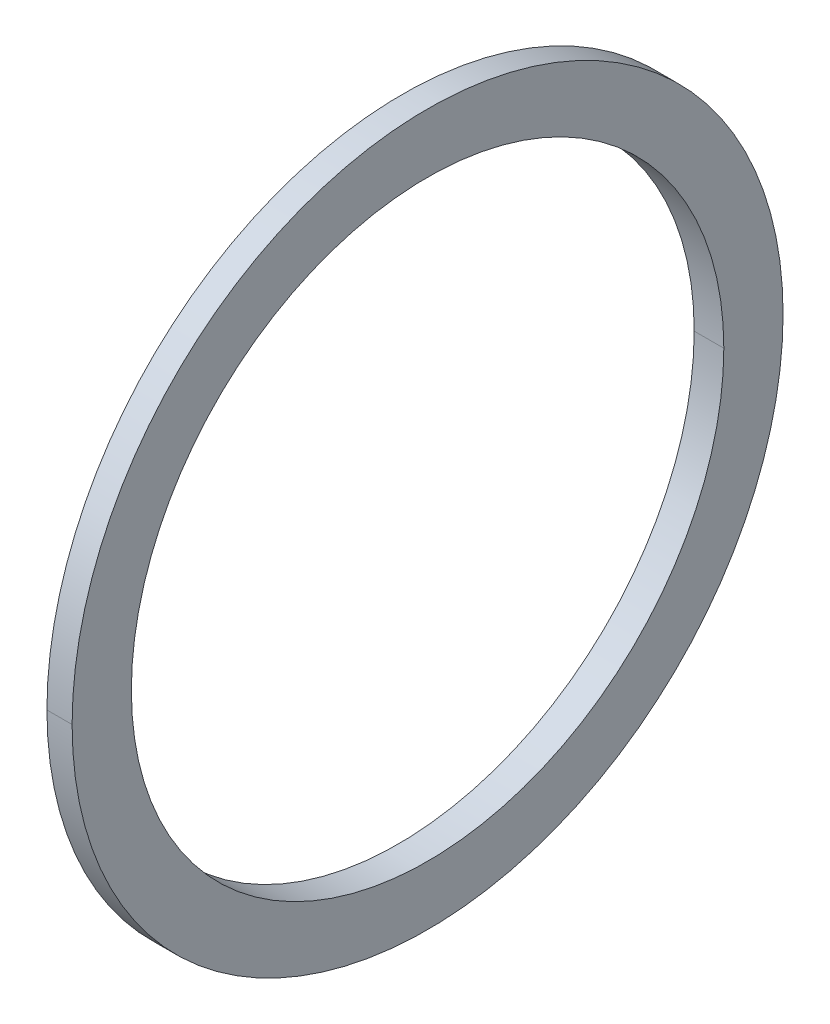
ISO-10303-21;
HEADER;
FILE_DESCRIPTION(('STEP AP214'),'2;1');
FILE_NAME('part.step','',(''),(''),'','','');
FILE_SCHEMA(('AUTOMOTIVE_DESIGN { 1 0 10303 214 1 1 1 1 }'));
ENDSEC;
DATA;
#1=APPLICATION_CONTEXT('core data for automotive mechanical design processes');
#2=APPLICATION_PROTOCOL_DEFINITION('international standard','automotive_design',2000,#1);
#3=PRODUCT_CONTEXT('',#1,'mechanical');
#4=PRODUCT('Part','Part','',(#3));
#5=PRODUCT_RELATED_PRODUCT_CATEGORY('part','',(#4));
#6=PRODUCT_DEFINITION_FORMATION('','',#4);
#7=PRODUCT_DEFINITION_CONTEXT('part definition',#1,'design');
#8=PRODUCT_DEFINITION('design','',#6,#7);
#9=PRODUCT_DEFINITION_SHAPE('','',#8);
#10=(LENGTH_UNIT() NAMED_UNIT(*) SI_UNIT(.MILLI.,.METRE.));
#11=(NAMED_UNIT(*) PLANE_ANGLE_UNIT() SI_UNIT($,.RADIAN.));
#12=(NAMED_UNIT(*) SI_UNIT($,.STERADIAN.) SOLID_ANGLE_UNIT());
#13=UNCERTAINTY_MEASURE_WITH_UNIT(LENGTH_MEASURE(1.E-05),#10,'distance_accuracy_value','');
#14=(GEOMETRIC_REPRESENTATION_CONTEXT(3) GLOBAL_UNCERTAINTY_ASSIGNED_CONTEXT((#13)) GLOBAL_UNIT_ASSIGNED_CONTEXT((#10,
#11,#12)) REPRESENTATION_CONTEXT('',''));
#15=CARTESIAN_POINT('',(0.,0.,0.));
#16=DIRECTION('',(0.,0.,1.));
#17=DIRECTION('',(1.,0.,0.));
#18=AXIS2_PLACEMENT_3D('',#15,#16,#17);
#19=CARTESIAN_POINT('',(0.,0.,0.));
#20=DIRECTION('',(-1.,0.,0.));
#21=DIRECTION('',(0.,0.,1.));
#22=AXIS2_PLACEMENT_3D('',#19,#20,#21);
#23=CYLINDRICAL_SURFACE('',#22,20.);
#24=DIRECTION('',(-1.,0.,0.));
#25=VECTOR('',#24,1.);
#26=CARTESIAN_POINT('',(0.,0.,-20.));
#27=LINE('',#26,#25);
#28=CARTESIAN_POINT('',(10.1578226323666,0.,-20.));
#29=VERTEX_POINT('',#28);
#30=CARTESIAN_POINT('',(8.15782263236658,0.,-20.));
#31=VERTEX_POINT('',#30);
#32=EDGE_CURVE('E107',#29,#31,#27,.T.);
#33=ORIENTED_EDGE('',*,*,#32,.F.);
#34=CARTESIAN_POINT('',(10.1578226323666,0.,0.));
#35=DIRECTION('',(-1.,0.,0.));
#36=DIRECTION('',(0.,0.,1.));
#37=AXIS2_PLACEMENT_3D('',#34,#35,#36);
#38=CIRCLE('',#37,20.);
#39=CARTESIAN_POINT('',(10.1578226323666,0.,20.));
#40=VERTEX_POINT('',#39);
#41=EDGE_CURVE('E79',#40,#29,#38,.T.);
#42=ORIENTED_EDGE('',*,*,#41,.F.);
#43=DIRECTION('',(-1.,0.,0.));
#44=VECTOR('',#43,1.);
#45=CARTESIAN_POINT('',(0.,0.,20.));
#46=LINE('',#45,#44);
#47=CARTESIAN_POINT('',(8.15782263236658,0.,20.));
#48=VERTEX_POINT('',#47);
#49=EDGE_CURVE('E106',#40,#48,#46,.T.);
#50=ORIENTED_EDGE('',*,*,#49,.T.);
#51=CARTESIAN_POINT('',(8.15782263236658,0.,0.));
#52=DIRECTION('',(-1.,0.,0.));
#53=DIRECTION('',(0.,0.,1.));
#54=AXIS2_PLACEMENT_3D('',#51,#52,#53);
#55=CIRCLE('',#54,20.);
#56=EDGE_CURVE('E11',#48,#31,#55,.T.);
#57=ORIENTED_EDGE('',*,*,#56,.T.);
#58=EDGE_LOOP('',(#33,#42,#50,#57));
#59=FACE_BOUND('',#58,.T.);
#60=ADVANCED_FACE('F17',(#59),#23,.F.);
#61=CARTESIAN_POINT('',(8.15782263236658,21.4,0.));
#62=DIRECTION('',(1.,0.,0.));
#63=DIRECTION('',(0.,1.,0.));
#64=AXIS2_PLACEMENT_3D('',#61,#62,#63);
#65=PLANE('',#64);
#66=ORIENTED_EDGE('',*,*,#56,.F.);
#67=CARTESIAN_POINT('',(8.15782263236658,0.,0.));
#68=DIRECTION('',(-1.,0.,0.));
#69=DIRECTION('',(0.,0.,1.));
#70=AXIS2_PLACEMENT_3D('',#67,#68,#69);
#71=CIRCLE('',#70,20.);
#72=EDGE_CURVE('E103',#31,#48,#71,.T.);
#73=ORIENTED_EDGE('',*,*,#72,.F.);
#74=EDGE_LOOP('',(#66,#73));
#75=FACE_BOUND('',#74,.T.);
#76=CARTESIAN_POINT('',(8.15782263236658,0.,0.));
#77=DIRECTION('',(-1.,0.,0.));
#78=DIRECTION('',(0.,0.,1.));
#79=AXIS2_PLACEMENT_3D('',#76,#77,#78);
#80=CIRCLE('',#79,21.4);
#81=CARTESIAN_POINT('',(8.15782263236658,0.,21.4));
#82=VERTEX_POINT('',#81);
#83=CARTESIAN_POINT('',(8.15782263236658,0.,-21.4));
#84=VERTEX_POINT('',#83);
#85=EDGE_CURVE('E99',#82,#84,#80,.T.);
#86=ORIENTED_EDGE('',*,*,#85,.T.);
#87=CARTESIAN_POINT('',(8.15782263236658,0.,0.));
#88=DIRECTION('',(-1.,0.,0.));
#89=DIRECTION('',(0.,0.,1.));
#90=AXIS2_PLACEMENT_3D('',#87,#88,#89);
#91=CIRCLE('',#90,21.4);
#92=EDGE_CURVE('E26',#84,#82,#91,.T.);
#93=ORIENTED_EDGE('',*,*,#92,.T.);
#94=EDGE_LOOP('',(#86,#93));
#95=FACE_BOUND('',#94,.T.);
#96=ADVANCED_FACE('F136',(#75,#95),#65,.F.);
#97=CARTESIAN_POINT('',(0.,0.,0.));
#98=DIRECTION('',(-1.,0.,0.));
#99=DIRECTION('',(0.,0.,1.));
#100=AXIS2_PLACEMENT_3D('',#97,#98,#99);
#101=CYLINDRICAL_SURFACE('',#100,21.4);
#102=DIRECTION('',(-1.,0.,0.));
#103=VECTOR('',#102,1.);
#104=CARTESIAN_POINT('',(0.,0.,-21.4));
#105=LINE('',#104,#103);
#106=CARTESIAN_POINT('',(8.45782263236658,0.,-21.4));
#107=VERTEX_POINT('',#106);
#108=EDGE_CURVE('E115',#107,#84,#105,.T.);
#109=ORIENTED_EDGE('',*,*,#108,.F.);
#110=CARTESIAN_POINT('',(8.45782263236658,0.,0.));
#111=DIRECTION('',(-1.,0.,0.));
#112=DIRECTION('',(0.,0.,1.));
#113=AXIS2_PLACEMENT_3D('',#110,#111,#112);
#114=CIRCLE('',#113,21.4);
#115=CARTESIAN_POINT('',(8.45782263236658,0.,21.4));
#116=VERTEX_POINT('',#115);
#117=EDGE_CURVE('E129',#107,#116,#114,.T.);
#118=ORIENTED_EDGE('',*,*,#117,.T.);
#119=DIRECTION('',(-1.,0.,0.));
#120=VECTOR('',#119,1.);
#121=CARTESIAN_POINT('',(0.,0.,21.4));
#122=LINE('',#121,#120);
#123=EDGE_CURVE('E92',#116,#82,#122,.T.);
#124=ORIENTED_EDGE('',*,*,#123,.T.);
#125=ORIENTED_EDGE('',*,*,#92,.F.);
#126=EDGE_LOOP('',(#109,#118,#124,#125));
#127=FACE_BOUND('',#126,.T.);
#128=ADVANCED_FACE('F143',(#127),#101,.T.);
#129=CARTESIAN_POINT('',(8.45782263236658,24.,0.));
#130=DIRECTION('',(1.,0.,0.));
#131=DIRECTION('',(0.,1.,0.));
#132=AXIS2_PLACEMENT_3D('',#129,#130,#131);
#133=PLANE('',#132);
#134=CARTESIAN_POINT('',(8.45782263236658,0.,0.));
#135=DIRECTION('',(-1.,0.,0.));
#136=DIRECTION('',(0.,0.,1.));
#137=AXIS2_PLACEMENT_3D('',#134,#135,#136);
#138=CIRCLE('',#137,21.4);
#139=EDGE_CURVE('E111',#116,#107,#138,.T.);
#140=ORIENTED_EDGE('',*,*,#139,.F.);
#141=ORIENTED_EDGE('',*,*,#117,.F.);
#142=EDGE_LOOP('',(#140,#141));
#143=FACE_BOUND('',#142,.T.);
#144=CARTESIAN_POINT('',(8.45782263236658,0.,0.));
#145=DIRECTION('',(-1.,0.,0.));
#146=DIRECTION('',(0.,0.,1.));
#147=AXIS2_PLACEMENT_3D('',#144,#145,#146);
#148=CIRCLE('',#147,24.);
#149=CARTESIAN_POINT('',(8.45782263236658,0.,24.));
#150=VERTEX_POINT('',#149);
#151=CARTESIAN_POINT('',(8.45782263236658,0.,-24.));
#152=VERTEX_POINT('',#151);
#153=EDGE_CURVE('E88',#150,#152,#148,.T.);
#154=ORIENTED_EDGE('',*,*,#153,.T.);
#155=CARTESIAN_POINT('',(8.45782263236658,0.,0.));
#156=DIRECTION('',(-1.,0.,0.));
#157=DIRECTION('',(0.,0.,1.));
#158=AXIS2_PLACEMENT_3D('',#155,#156,#157);
#159=CIRCLE('',#158,24.);
#160=EDGE_CURVE('E38',#152,#150,#159,.T.);
#161=ORIENTED_EDGE('',*,*,#160,.T.);
#162=EDGE_LOOP('',(#154,#161));
#163=FACE_BOUND('',#162,.T.);
#164=ADVANCED_FACE('F148',(#143,#163),#133,.F.);
#165=CARTESIAN_POINT('',(0.,0.,0.));
#166=DIRECTION('',(-1.,0.,0.));
#167=DIRECTION('',(0.,0.,1.));
#168=AXIS2_PLACEMENT_3D('',#165,#166,#167);
#169=CYLINDRICAL_SURFACE('',#168,24.);
#170=DIRECTION('',(-1.,0.,0.));
#171=VECTOR('',#170,1.);
#172=CARTESIAN_POINT('',(0.,0.,-24.));
#173=LINE('',#172,#171);
#174=CARTESIAN_POINT('',(10.1578226323666,0.,-24.));
#175=VERTEX_POINT('',#174);
#176=EDGE_CURVE('E83',#175,#152,#173,.T.);
#177=ORIENTED_EDGE('',*,*,#176,.F.);
#178=CARTESIAN_POINT('',(10.1578226323666,0.,0.));
#179=DIRECTION('',(-1.,0.,0.));
#180=DIRECTION('',(0.,0.,1.));
#181=AXIS2_PLACEMENT_3D('',#178,#179,#180);
#182=CIRCLE('',#181,24.);
#183=CARTESIAN_POINT('',(10.1578226323666,0.,24.));
#184=VERTEX_POINT('',#183);
#185=EDGE_CURVE('E71',#175,#184,#182,.T.);
#186=ORIENTED_EDGE('',*,*,#185,.T.);
#187=DIRECTION('',(-1.,0.,0.));
#188=VECTOR('',#187,1.);
#189=CARTESIAN_POINT('',(0.,0.,24.));
#190=LINE('',#189,#188);
#191=EDGE_CURVE('E80',#184,#150,#190,.T.);
#192=ORIENTED_EDGE('',*,*,#191,.T.);
#193=ORIENTED_EDGE('',*,*,#160,.F.);
#194=EDGE_LOOP('',(#177,#186,#192,#193));
#195=FACE_BOUND('',#194,.T.);
#196=ADVANCED_FACE('F84',(#195),#169,.T.);
#197=CARTESIAN_POINT('',(10.1578226323666,20.,0.));
#198=DIRECTION('',(-1.,0.,0.));
#199=DIRECTION('',(0.,0.,1.));
#200=AXIS2_PLACEMENT_3D('',#197,#198,#199);
#201=PLANE('',#200);
#202=ORIENTED_EDGE('',*,*,#41,.T.);
#203=CARTESIAN_POINT('',(10.1578226323666,0.,0.));
#204=DIRECTION('',(-1.,0.,0.));
#205=DIRECTION('',(0.,0.,1.));
#206=AXIS2_PLACEMENT_3D('',#203,#204,#205);
#207=CIRCLE('',#206,20.);
#208=EDGE_CURVE('E158',#29,#40,#207,.T.);
#209=ORIENTED_EDGE('',*,*,#208,.T.);
#210=EDGE_LOOP('',(#202,#209));
#211=FACE_BOUND('',#210,.T.);
#212=CARTESIAN_POINT('',(10.1578226323666,0.,0.));
#213=DIRECTION('',(-1.,0.,0.));
#214=DIRECTION('',(0.,0.,1.));
#215=AXIS2_PLACEMENT_3D('',#212,#213,#214);
#216=CIRCLE('',#215,24.);
#217=EDGE_CURVE('E75',#184,#175,#216,.T.);
#218=ORIENTED_EDGE('',*,*,#217,.F.);
#219=ORIENTED_EDGE('',*,*,#185,.F.);
#220=EDGE_LOOP('',(#218,#219));
#221=FACE_BOUND('',#220,.T.);
#222=ADVANCED_FACE('F73',(#211,#221),#201,.F.);
#223=CARTESIAN_POINT('',(0.,0.,0.));
#224=DIRECTION('',(-1.,0.,0.));
#225=DIRECTION('',(0.,0.,1.));
#226=AXIS2_PLACEMENT_3D('',#223,#224,#225);
#227=CYLINDRICAL_SURFACE('',#226,24.);
#228=ORIENTED_EDGE('',*,*,#217,.T.);
#229=ORIENTED_EDGE('',*,*,#176,.T.);
#230=ORIENTED_EDGE('',*,*,#153,.F.);
#231=ORIENTED_EDGE('',*,*,#191,.F.);
#232=EDGE_LOOP('',(#228,#229,#230,#231));
#233=FACE_BOUND('',#232,.T.);
#234=ADVANCED_FACE('F90',(#233),#227,.T.);
#235=CARTESIAN_POINT('',(0.,0.,0.));
#236=DIRECTION('',(-1.,0.,0.));
#237=DIRECTION('',(0.,0.,1.));
#238=AXIS2_PLACEMENT_3D('',#235,#236,#237);
#239=CYLINDRICAL_SURFACE('',#238,21.4);
#240=ORIENTED_EDGE('',*,*,#139,.T.);
#241=ORIENTED_EDGE('',*,*,#108,.T.);
#242=ORIENTED_EDGE('',*,*,#85,.F.);
#243=ORIENTED_EDGE('',*,*,#123,.F.);
#244=EDGE_LOOP('',(#240,#241,#242,#243));
#245=FACE_BOUND('',#244,.T.);
#246=ADVANCED_FACE('F146',(#245),#239,.T.);
#247=CARTESIAN_POINT('',(0.,0.,0.));
#248=DIRECTION('',(-1.,0.,0.));
#249=DIRECTION('',(0.,0.,1.));
#250=AXIS2_PLACEMENT_3D('',#247,#248,#249);
#251=CYLINDRICAL_SURFACE('',#250,20.);
#252=ORIENTED_EDGE('',*,*,#208,.F.);
#253=ORIENTED_EDGE('',*,*,#32,.T.);
#254=ORIENTED_EDGE('',*,*,#72,.T.);
#255=ORIENTED_EDGE('',*,*,#49,.F.);
#256=EDGE_LOOP('',(#252,#253,#254,#255));
#257=FACE_BOUND('',#256,.T.);
#258=ADVANCED_FACE('F172',(#257),#251,.F.);
#259=CLOSED_SHELL('',(#60,#96,#128,#164,#196,#222,#234,#246,#258));
#260=MANIFOLD_SOLID_BREP('B1',#259);
#261=ADVANCED_BREP_SHAPE_REPRESENTATION('',(#18,#260),#14);
#262=SHAPE_DEFINITION_REPRESENTATION(#9,#261);
ENDSEC;
END-ISO-10303-21;
